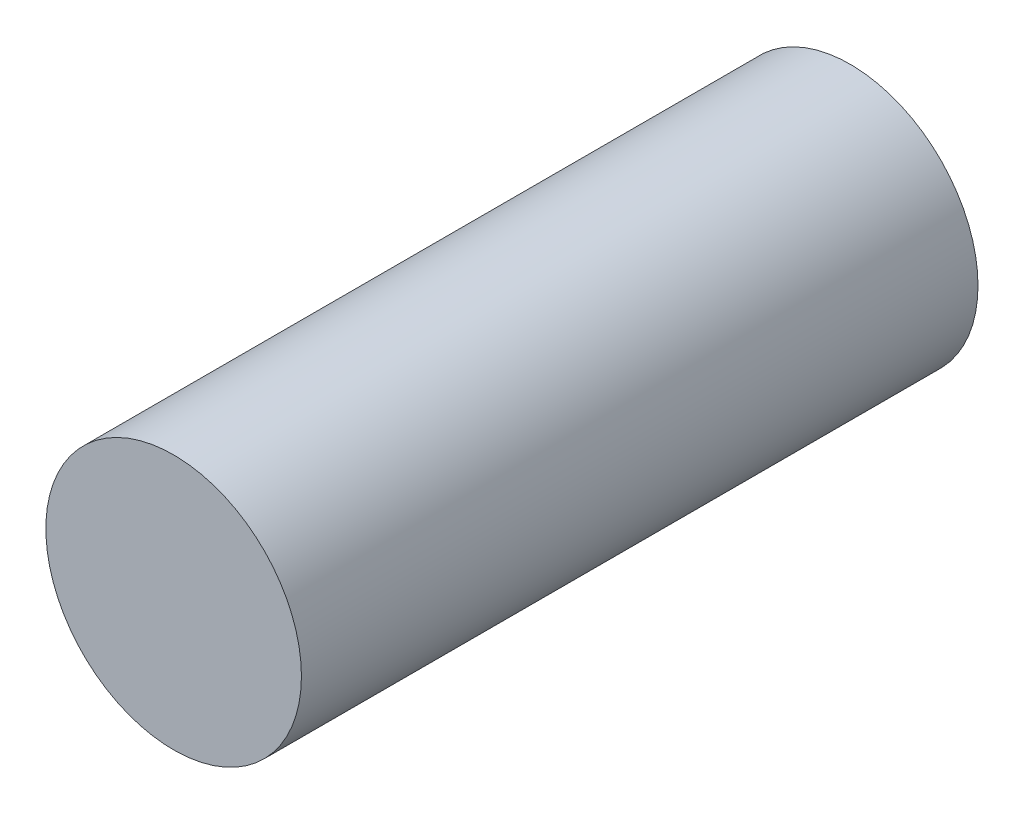
ISO-10303-21;
HEADER;
FILE_DESCRIPTION(('STEP AP214'),'2;1');
FILE_NAME('part.step','',(''),(''),'','','');
FILE_SCHEMA(('AUTOMOTIVE_DESIGN { 1 0 10303 214 1 1 1 1 }'));
ENDSEC;
DATA;
#1=APPLICATION_CONTEXT('core data for automotive mechanical design processes');
#2=APPLICATION_PROTOCOL_DEFINITION('international standard','automotive_design',2000,#1);
#3=PRODUCT_CONTEXT('',#1,'mechanical');
#4=PRODUCT('Part','Part','',(#3));
#5=PRODUCT_RELATED_PRODUCT_CATEGORY('part','',(#4));
#6=PRODUCT_DEFINITION_FORMATION('','',#4);
#7=PRODUCT_DEFINITION_CONTEXT('part definition',#1,'design');
#8=PRODUCT_DEFINITION('design','',#6,#7);
#9=PRODUCT_DEFINITION_SHAPE('','',#8);
#10=(LENGTH_UNIT() NAMED_UNIT(*) SI_UNIT(.MILLI.,.METRE.));
#11=(NAMED_UNIT(*) PLANE_ANGLE_UNIT() SI_UNIT($,.RADIAN.));
#12=(NAMED_UNIT(*) SI_UNIT($,.STERADIAN.) SOLID_ANGLE_UNIT());
#13=UNCERTAINTY_MEASURE_WITH_UNIT(LENGTH_MEASURE(1.E-05),#10,'distance_accuracy_value','');
#14=(GEOMETRIC_REPRESENTATION_CONTEXT(3) GLOBAL_UNCERTAINTY_ASSIGNED_CONTEXT((#13)) GLOBAL_UNIT_ASSIGNED_CONTEXT((#10,
#11,#12)) REPRESENTATION_CONTEXT('',''));
#15=CARTESIAN_POINT('',(0.,0.,0.));
#16=DIRECTION('',(0.,0.,1.));
#17=DIRECTION('',(1.,0.,0.));
#18=AXIS2_PLACEMENT_3D('',#15,#16,#17);
#19=CARTESIAN_POINT('',(0.325,0.56291651246,0.));
#20=DIRECTION('',(0.,1.,0.));
#21=DIRECTION('',(0.,0.,1.));
#22=AXIS2_PLACEMENT_3D('',#19,#20,#21);
#23=PLANE('',#22);
#24=DIRECTION('',(1.,0.,0.));
#25=VECTOR('',#24,1.);
#26=CARTESIAN_POINT('',(0.325,0.56291651246,0.));
#27=LINE('',#26,#25);
#28=CARTESIAN_POINT('',(0.324999999999957,0.562916512459975,0.));
#29=VERTEX_POINT('',#28);
#30=CARTESIAN_POINT('',(-0.325,0.56291651246,0.));
#31=VERTEX_POINT('',#30);
#32=EDGE_CURVE('E66',#29,#31,#27,.F.);
#33=ORIENTED_EDGE('',*,*,#32,.F.);
#34=DIRECTION('',(0.,0.,1.));
#35=VECTOR('',#34,1.);
#36=CARTESIAN_POINT('',(0.324999999999827,0.5629165124599,0.));
#37=LINE('',#36,#35);
#38=CARTESIAN_POINT('',(0.324999999999957,0.562916512459975,2.));
#39=VERTEX_POINT('',#38);
#40=EDGE_CURVE('E88',#29,#39,#37,.T.);
#41=ORIENTED_EDGE('',*,*,#40,.T.);
#42=DIRECTION('',(1.,0.,0.));
#43=VECTOR('',#42,1.);
#44=CARTESIAN_POINT('',(0.325,0.56291651246,2.));
#45=LINE('',#44,#43);
#46=CARTESIAN_POINT('',(-0.325,0.56291651246,2.));
#47=VERTEX_POINT('',#46);
#48=EDGE_CURVE('E77',#47,#39,#45,.T.);
#49=ORIENTED_EDGE('',*,*,#48,.F.);
#50=DIRECTION('',(0.,0.,1.));
#51=VECTOR('',#50,1.);
#52=CARTESIAN_POINT('',(-0.325,0.56291651246,0.));
#53=LINE('',#52,#51);
#54=EDGE_CURVE('E76',#47,#31,#53,.F.);
#55=ORIENTED_EDGE('',*,*,#54,.T.);
#56=EDGE_LOOP('',(#33,#41,#49,#55));
#57=FACE_BOUND('',#56,.T.);
#58=ADVANCED_FACE('F16',(#57),#23,.F.);
#59=CARTESIAN_POINT('',(-0.325,0.56291651246,0.));
#60=DIRECTION('',(-0.866025403784329,0.50000000000019,0.));
#61=DIRECTION('',(-0.50000000000019,-0.866025403784329,0.));
#62=AXIS2_PLACEMENT_3D('',#59,#60,#61);
#63=PLANE('',#62);
#64=DIRECTION('',(-0.50000000000019,-0.866025403784329,0.));
#65=VECTOR('',#64,1.);
#66=CARTESIAN_POINT('',(-0.325,0.56291651246,0.));
#67=LINE('',#66,#65);
#68=CARTESIAN_POINT('',(-0.650000000000087,0.,0.));
#69=VERTEX_POINT('',#68);
#70=EDGE_CURVE('E71',#31,#69,#67,.T.);
#71=ORIENTED_EDGE('',*,*,#70,.F.);
#72=ORIENTED_EDGE('',*,*,#54,.F.);
#73=DIRECTION('',(0.499999999999924,0.866025403784483,0.));
#74=VECTOR('',#73,1.);
#75=CARTESIAN_POINT('',(-0.65,0.,2.));
#76=LINE('',#75,#74);
#77=CARTESIAN_POINT('',(-0.65000000000013,0.,2.));
#78=VERTEX_POINT('',#77);
#79=EDGE_CURVE('E98',#78,#47,#76,.T.);
#80=ORIENTED_EDGE('',*,*,#79,.F.);
#81=DIRECTION('',(0.,0.,1.));
#82=VECTOR('',#81,1.);
#83=CARTESIAN_POINT('',(-0.650000000000173,0.,0.));
#84=LINE('',#83,#82);
#85=EDGE_CURVE('E85',#69,#78,#84,.T.);
#86=ORIENTED_EDGE('',*,*,#85,.F.);
#87=EDGE_LOOP('',(#71,#72,#80,#86));
#88=FACE_BOUND('',#87,.T.);
#89=ADVANCED_FACE('F83',(#88),#63,.F.);
#90=CARTESIAN_POINT('',(0.65,0.,0.));
#91=DIRECTION('',(0.866025403784329,0.50000000000019,0.));
#92=DIRECTION('',(-0.50000000000019,0.866025403784329,0.));
#93=AXIS2_PLACEMENT_3D('',#90,#91,#92);
#94=PLANE('',#93);
#95=DIRECTION('',(-0.50000000000019,0.866025403784329,0.));
#96=VECTOR('',#95,1.);
#97=CARTESIAN_POINT('',(0.65,0.,0.));
#98=LINE('',#97,#96);
#99=CARTESIAN_POINT('',(0.650000000000043,0.,0.));
#100=VERTEX_POINT('',#99);
#101=EDGE_CURVE('E64',#100,#29,#98,.T.);
#102=ORIENTED_EDGE('',*,*,#101,.F.);
#103=DIRECTION('',(0.,0.,1.));
#104=VECTOR('',#103,1.);
#105=CARTESIAN_POINT('',(0.650000000000173,0.,0.));
#106=LINE('',#105,#104);
#107=CARTESIAN_POINT('',(0.650000000000043,0.,2.));
#108=VERTEX_POINT('',#107);
#109=EDGE_CURVE('E101',#100,#108,#106,.T.);
#110=ORIENTED_EDGE('',*,*,#109,.T.);
#111=DIRECTION('',(0.499999999999924,-0.866025403784483,0.));
#112=VECTOR('',#111,1.);
#113=CARTESIAN_POINT('',(0.325,0.56291651246,2.));
#114=LINE('',#113,#112);
#115=EDGE_CURVE('E95',#39,#108,#114,.T.);
#116=ORIENTED_EDGE('',*,*,#115,.F.);
#117=ORIENTED_EDGE('',*,*,#40,.F.);
#118=EDGE_LOOP('',(#102,#110,#116,#117));
#119=FACE_BOUND('',#118,.T.);
#120=ADVANCED_FACE('F100',(#119),#94,.F.);
#121=CARTESIAN_POINT('',(0.,0.,2.));
#122=DIRECTION('',(0.,0.,-1.));
#123=DIRECTION('',(-1.,0.,0.));
#124=AXIS2_PLACEMENT_3D('',#121,#122,#123);
#125=PLANE('',#124);
#126=DIRECTION('',(0.50000000000019,0.866025403784329,0.));
#127=VECTOR('',#126,1.);
#128=CARTESIAN_POINT('',(0.325,-0.56291651246,2.));
#129=LINE('',#128,#127);
#130=CARTESIAN_POINT('',(0.325,-0.56291651246,2.));
#131=VERTEX_POINT('',#130);
#132=EDGE_CURVE('E112',#108,#131,#129,.F.);
#133=ORIENTED_EDGE('',*,*,#132,.T.);
#134=DIRECTION('',(1.,0.,0.));
#135=VECTOR('',#134,1.);
#136=CARTESIAN_POINT('',(-0.325,-0.56291651246,2.));
#137=LINE('',#136,#135);
#138=CARTESIAN_POINT('',(-0.325,-0.56291651246,2.));
#139=VERTEX_POINT('',#138);
#140=EDGE_CURVE('E116',#131,#139,#137,.F.);
#141=ORIENTED_EDGE('',*,*,#140,.T.);
#142=DIRECTION('',(-0.50000000000019,0.866025403784329,0.));
#143=VECTOR('',#142,1.);
#144=CARTESIAN_POINT('',(-0.325,-0.56291651246,2.));
#145=LINE('',#144,#143);
#146=EDGE_CURVE('E109',#78,#139,#145,.F.);
#147=ORIENTED_EDGE('',*,*,#146,.F.);
#148=ORIENTED_EDGE('',*,*,#79,.T.);
#149=ORIENTED_EDGE('',*,*,#48,.T.);
#150=ORIENTED_EDGE('',*,*,#115,.T.);
#151=EDGE_LOOP('',(#133,#141,#147,#148,#149,#150));
#152=FACE_BOUND('',#151,.T.);
#153=ADVANCED_FACE('F93',(#152),#125,.T.);
#154=CARTESIAN_POINT('',(-0.325,-0.56291651246,0.));
#155=DIRECTION('',(0.866025403784329,0.50000000000019,0.));
#156=DIRECTION('',(-0.50000000000019,0.866025403784329,0.));
#157=AXIS2_PLACEMENT_3D('',#154,#155,#156);
#158=PLANE('',#157);
#159=ORIENTED_EDGE('',*,*,#85,.T.);
#160=ORIENTED_EDGE('',*,*,#146,.T.);
#161=DIRECTION('',(0.,0.,-1.));
#162=VECTOR('',#161,1.);
#163=CARTESIAN_POINT('',(-0.325,-0.56291651246,0.));
#164=LINE('',#163,#162);
#165=CARTESIAN_POINT('',(-0.325,-0.56291651246,0.));
#166=VERTEX_POINT('',#165);
#167=EDGE_CURVE('E118',#139,#166,#164,.T.);
#168=ORIENTED_EDGE('',*,*,#167,.T.);
#169=DIRECTION('',(-0.50000000000019,0.866025403784329,0.));
#170=VECTOR('',#169,1.);
#171=CARTESIAN_POINT('',(-0.325,-0.56291651246,0.));
#172=LINE('',#171,#170);
#173=EDGE_CURVE('E103',#166,#69,#172,.T.);
#174=ORIENTED_EDGE('',*,*,#173,.T.);
#175=EDGE_LOOP('',(#159,#160,#168,#174));
#176=FACE_BOUND('',#175,.T.);
#177=ADVANCED_FACE('F202',(#176),#158,.T.);
#178=CARTESIAN_POINT('',(0.325,-0.56291651246,0.));
#179=DIRECTION('',(0.866025403784329,-0.50000000000019,0.));
#180=DIRECTION('',(0.50000000000019,0.866025403784329,0.));
#181=AXIS2_PLACEMENT_3D('',#178,#179,#180);
#182=PLANE('',#181);
#183=DIRECTION('',(0.50000000000019,0.866025403784329,0.));
#184=VECTOR('',#183,1.);
#185=CARTESIAN_POINT('',(0.325,-0.56291651246,0.));
#186=LINE('',#185,#184);
#187=CARTESIAN_POINT('',(0.325,-0.56291651246,0.));
#188=VERTEX_POINT('',#187);
#189=EDGE_CURVE('E32',#188,#100,#186,.T.);
#190=ORIENTED_EDGE('',*,*,#189,.F.);
#191=DIRECTION('',(0.,0.,-1.));
#192=VECTOR('',#191,1.);
#193=CARTESIAN_POINT('',(0.325,-0.56291651246,0.));
#194=LINE('',#193,#192);
#195=EDGE_CURVE('E121',#188,#131,#194,.F.);
#196=ORIENTED_EDGE('',*,*,#195,.T.);
#197=ORIENTED_EDGE('',*,*,#132,.F.);
#198=ORIENTED_EDGE('',*,*,#109,.F.);
#199=EDGE_LOOP('',(#190,#196,#197,#198));
#200=FACE_BOUND('',#199,.T.);
#201=ADVANCED_FACE('F145',(#200),#182,.F.);
#202=CARTESIAN_POINT('',(-0.325,-0.56291651246,0.));
#203=DIRECTION('',(0.,-1.,0.));
#204=DIRECTION('',(0.,0.,-1.));
#205=AXIS2_PLACEMENT_3D('',#202,#203,#204);
#206=PLANE('',#205);
#207=DIRECTION('',(1.,0.,0.));
#208=VECTOR('',#207,1.);
#209=CARTESIAN_POINT('',(0.,-0.56291651246,0.));
#210=LINE('',#209,#208);
#211=EDGE_CURVE('E123',#188,#166,#210,.F.);
#212=ORIENTED_EDGE('',*,*,#211,.T.);
#213=ORIENTED_EDGE('',*,*,#167,.F.);
#214=ORIENTED_EDGE('',*,*,#140,.F.);
#215=ORIENTED_EDGE('',*,*,#195,.F.);
#216=EDGE_LOOP('',(#212,#213,#214,#215));
#217=FACE_BOUND('',#216,.T.);
#218=ADVANCED_FACE('F135',(#217),#206,.F.);
#219=CARTESIAN_POINT('',(0.,0.,0.));
#220=DIRECTION('',(0.,0.,1.));
#221=DIRECTION('',(1.,0.,0.));
#222=AXIS2_PLACEMENT_3D('',#219,#220,#221);
#223=PLANE('',#222);
#224=ORIENTED_EDGE('',*,*,#189,.T.);
#225=ORIENTED_EDGE('',*,*,#101,.T.);
#226=ORIENTED_EDGE('',*,*,#32,.T.);
#227=ORIENTED_EDGE('',*,*,#70,.T.);
#228=ORIENTED_EDGE('',*,*,#173,.F.);
#229=ORIENTED_EDGE('',*,*,#211,.F.);
#230=EDGE_LOOP('',(#224,#225,#226,#227,#228,#229));
#231=FACE_BOUND('',#230,.T.);
#232=CARTESIAN_POINT('',(0.,0.,0.));
#233=DIRECTION('',(0.,0.,1.));
#234=DIRECTION('',(1.,0.,0.));
#235=AXIS2_PLACEMENT_3D('',#232,#233,#234);
#236=CIRCLE('',#235,0.85);
#237=CARTESIAN_POINT('',(0.85,0.,0.));
#238=VERTEX_POINT('',#237);
#239=EDGE_CURVE('E19',#238,#238,#236,.T.);
#240=ORIENTED_EDGE('',*,*,#239,.F.);
#241=EDGE_LOOP('',(#240));
#242=FACE_BOUND('',#241,.T.);
#243=ADVANCED_FACE('F68',(#231,#242),#223,.F.);
#244=CARTESIAN_POINT('',(0.,0.,4.5));
#245=DIRECTION('',(0.,0.,1.));
#246=DIRECTION('',(1.,0.,0.));
#247=AXIS2_PLACEMENT_3D('',#244,#245,#246);
#248=PLANE('',#247);
#249=CARTESIAN_POINT('',(0.,0.,4.5));
#250=DIRECTION('',(0.,0.,1.));
#251=DIRECTION('',(1.,0.,0.));
#252=AXIS2_PLACEMENT_3D('',#249,#250,#251);
#253=CIRCLE('',#252,0.85);
#254=CARTESIAN_POINT('',(0.85,0.,4.5));
#255=VERTEX_POINT('',#254);
#256=EDGE_CURVE('E11',#255,#255,#253,.F.);
#257=ORIENTED_EDGE('',*,*,#256,.F.);
#258=EDGE_LOOP('',(#257));
#259=FACE_BOUND('',#258,.T.);
#260=ADVANCED_FACE('F134',(#259),#248,.T.);
#261=CARTESIAN_POINT('',(0.,0.,2.25));
#262=DIRECTION('',(0.,0.,1.));
#263=DIRECTION('',(1.,0.,0.));
#264=AXIS2_PLACEMENT_3D('',#261,#262,#263);
#265=CYLINDRICAL_SURFACE('',#264,0.85);
#266=ORIENTED_EDGE('',*,*,#239,.T.);
#267=EDGE_LOOP('',(#266));
#268=FACE_BOUND('',#267,.T.);
#269=ORIENTED_EDGE('',*,*,#256,.T.);
#270=EDGE_LOOP('',(#269));
#271=FACE_BOUND('',#270,.T.);
#272=ADVANCED_FACE('F131',(#268,#271),#265,.T.);
#273=CLOSED_SHELL('',(#58,#89,#120,#153,#177,#201,#218,#243,#260,#272));
#274=MANIFOLD_SOLID_BREP('B1',#273);
#275=ADVANCED_BREP_SHAPE_REPRESENTATION('',(#18,#274),#14);
#276=SHAPE_DEFINITION_REPRESENTATION(#9,#275);
ENDSEC;
END-ISO-10303-21;
